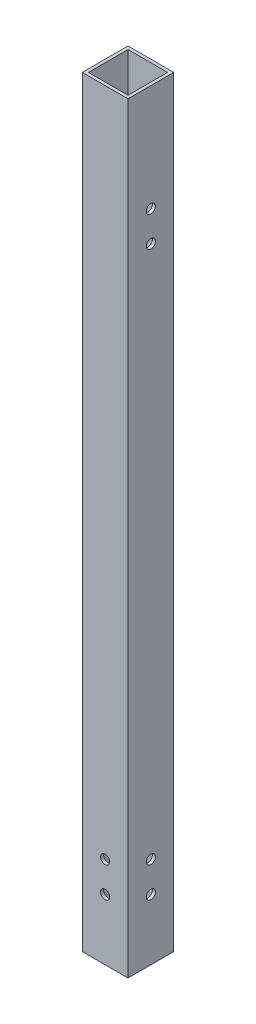
ISO-10303-21;
HEADER;
FILE_DESCRIPTION(('STEP AP214'),'2;1');
FILE_NAME('part.step','',(''),(''),'','','');
FILE_SCHEMA(('AUTOMOTIVE_DESIGN { 1 0 10303 214 1 1 1 1 }'));
ENDSEC;
DATA;
#1=APPLICATION_CONTEXT('core data for automotive mechanical design processes');
#2=APPLICATION_PROTOCOL_DEFINITION('international standard','automotive_design',2000,#1);
#3=PRODUCT_CONTEXT('',#1,'mechanical');
#4=PRODUCT('Part','Part','',(#3));
#5=PRODUCT_RELATED_PRODUCT_CATEGORY('part','',(#4));
#6=PRODUCT_DEFINITION_FORMATION('','',#4);
#7=PRODUCT_DEFINITION_CONTEXT('part definition',#1,'design');
#8=PRODUCT_DEFINITION('design','',#6,#7);
#9=PRODUCT_DEFINITION_SHAPE('','',#8);
#10=(LENGTH_UNIT() NAMED_UNIT(*) SI_UNIT(.MILLI.,.METRE.));
#11=(NAMED_UNIT(*) PLANE_ANGLE_UNIT() SI_UNIT($,.RADIAN.));
#12=(NAMED_UNIT(*) SI_UNIT($,.STERADIAN.) SOLID_ANGLE_UNIT());
#13=UNCERTAINTY_MEASURE_WITH_UNIT(LENGTH_MEASURE(1.E-05),#10,'distance_accuracy_value','');
#14=(GEOMETRIC_REPRESENTATION_CONTEXT(3) GLOBAL_UNCERTAINTY_ASSIGNED_CONTEXT((#13)) GLOBAL_UNIT_ASSIGNED_CONTEXT((#10,
#11,#12)) REPRESENTATION_CONTEXT('',''));
#15=CARTESIAN_POINT('',(0.,0.,0.));
#16=DIRECTION('',(0.,0.,1.));
#17=DIRECTION('',(1.,0.,0.));
#18=AXIS2_PLACEMENT_3D('',#15,#16,#17);
#19=CARTESIAN_POINT('',(15.,500.,15.));
#20=DIRECTION('',(0.,0.,-1.));
#21=DIRECTION('',(-1.,0.,0.));
#22=AXIS2_PLACEMENT_3D('',#19,#20,#21);
#23=PLANE('',#22);
#24=CARTESIAN_POINT('',(0.,60.,15.));
#25=DIRECTION('',(0.,0.,1.));
#26=DIRECTION('',(1.,0.,0.));
#27=AXIS2_PLACEMENT_3D('',#24,#25,#26);
#28=CIRCLE('',#27,3.);
#29=CARTESIAN_POINT('',(3.,60.,15.));
#30=VERTEX_POINT('',#29);
#31=EDGE_CURVE('E188',#30,#30,#28,.T.);
#32=ORIENTED_EDGE('',*,*,#31,.F.);
#33=EDGE_LOOP('',(#32));
#34=FACE_BOUND('',#33,.T.);
#35=CARTESIAN_POINT('',(0.,40.,15.));
#36=DIRECTION('',(0.,0.,1.));
#37=DIRECTION('',(1.,0.,0.));
#38=AXIS2_PLACEMENT_3D('',#35,#36,#37);
#39=CIRCLE('',#38,3.);
#40=CARTESIAN_POINT('',(3.,40.,15.));
#41=VERTEX_POINT('',#40);
#42=EDGE_CURVE('E207',#41,#41,#39,.T.);
#43=ORIENTED_EDGE('',*,*,#42,.F.);
#44=EDGE_LOOP('',(#43));
#45=FACE_BOUND('',#44,.T.);
#46=DIRECTION('',(1.,0.,0.));
#47=VECTOR('',#46,1.);
#48=CARTESIAN_POINT('',(15.,0.,15.));
#49=LINE('',#48,#47);
#50=CARTESIAN_POINT('',(-15.,0.,15.));
#51=VERTEX_POINT('',#50);
#52=CARTESIAN_POINT('',(15.,0.,15.));
#53=VERTEX_POINT('',#52);
#54=EDGE_CURVE('E134',#51,#53,#49,.T.);
#55=ORIENTED_EDGE('',*,*,#54,.T.);
#56=DIRECTION('',(0.,-1.,0.));
#57=VECTOR('',#56,1.);
#58=CARTESIAN_POINT('',(15.,500.,15.));
#59=LINE('',#58,#57);
#60=CARTESIAN_POINT('',(15.,500.,15.));
#61=VERTEX_POINT('',#60);
#62=EDGE_CURVE('E40',#61,#53,#59,.T.);
#63=ORIENTED_EDGE('',*,*,#62,.F.);
#64=DIRECTION('',(1.,0.,0.));
#65=VECTOR('',#64,1.);
#66=CARTESIAN_POINT('',(15.,500.,15.));
#67=LINE('',#66,#65);
#68=CARTESIAN_POINT('',(-15.,500.,15.));
#69=VERTEX_POINT('',#68);
#70=EDGE_CURVE('E141',#69,#61,#67,.T.);
#71=ORIENTED_EDGE('',*,*,#70,.F.);
#72=DIRECTION('',(0.,-1.,0.));
#73=VECTOR('',#72,1.);
#74=CARTESIAN_POINT('',(-15.,500.,15.));
#75=LINE('',#74,#73);
#76=EDGE_CURVE('E11',#69,#51,#75,.T.);
#77=ORIENTED_EDGE('',*,*,#76,.T.);
#78=EDGE_LOOP('',(#55,#63,#71,#77));
#79=FACE_BOUND('',#78,.T.);
#80=ADVANCED_FACE('F32',(#34,#45,#79),#23,.F.);
#81=CARTESIAN_POINT('',(15.,500.,-15.));
#82=DIRECTION('',(-1.,0.,0.));
#83=DIRECTION('',(0.,0.,1.));
#84=AXIS2_PLACEMENT_3D('',#81,#82,#83);
#85=PLANE('',#84);
#86=CARTESIAN_POINT('',(15.,410.,0.));
#87=DIRECTION('',(-1.,0.,0.));
#88=DIRECTION('',(0.,0.,1.));
#89=AXIS2_PLACEMENT_3D('',#86,#87,#88);
#90=CIRCLE('',#89,3.);
#91=CARTESIAN_POINT('',(15.,410.,3.));
#92=VERTEX_POINT('',#91);
#93=EDGE_CURVE('E484',#92,#92,#90,.T.);
#94=ORIENTED_EDGE('',*,*,#93,.T.);
#95=EDGE_LOOP('',(#94));
#96=FACE_BOUND('',#95,.T.);
#97=CARTESIAN_POINT('',(15.,430.,0.));
#98=DIRECTION('',(-1.,0.,0.));
#99=DIRECTION('',(0.,0.,1.));
#100=AXIS2_PLACEMENT_3D('',#97,#98,#99);
#101=CIRCLE('',#100,3.);
#102=CARTESIAN_POINT('',(15.,430.,3.));
#103=VERTEX_POINT('',#102);
#104=EDGE_CURVE('E184',#103,#103,#101,.T.);
#105=ORIENTED_EDGE('',*,*,#104,.T.);
#106=EDGE_LOOP('',(#105));
#107=FACE_BOUND('',#106,.T.);
#108=CARTESIAN_POINT('',(15.,40.,0.));
#109=DIRECTION('',(1.,0.,0.));
#110=DIRECTION('',(0.,0.,-1.));
#111=AXIS2_PLACEMENT_3D('',#108,#109,#110);
#112=CIRCLE('',#111,3.);
#113=CARTESIAN_POINT('',(15.,40.,-3.));
#114=VERTEX_POINT('',#113);
#115=EDGE_CURVE('E214',#114,#114,#112,.T.);
#116=ORIENTED_EDGE('',*,*,#115,.F.);
#117=EDGE_LOOP('',(#116));
#118=FACE_BOUND('',#117,.T.);
#119=CARTESIAN_POINT('',(15.,60.,0.));
#120=DIRECTION('',(1.,0.,0.));
#121=DIRECTION('',(0.,0.,-1.));
#122=AXIS2_PLACEMENT_3D('',#119,#120,#121);
#123=CIRCLE('',#122,3.);
#124=CARTESIAN_POINT('',(15.,60.,-3.));
#125=VERTEX_POINT('',#124);
#126=EDGE_CURVE('E221',#125,#125,#123,.T.);
#127=ORIENTED_EDGE('',*,*,#126,.F.);
#128=EDGE_LOOP('',(#127));
#129=FACE_BOUND('',#128,.T.);
#130=DIRECTION('',(0.,0.,-1.));
#131=VECTOR('',#130,1.);
#132=CARTESIAN_POINT('',(15.,0.,-15.));
#133=LINE('',#132,#131);
#134=CARTESIAN_POINT('',(15.,0.,-15.));
#135=VERTEX_POINT('',#134);
#136=EDGE_CURVE('E151',#53,#135,#133,.T.);
#137=ORIENTED_EDGE('',*,*,#136,.T.);
#138=DIRECTION('',(0.,-1.,0.));
#139=VECTOR('',#138,1.);
#140=CARTESIAN_POINT('',(15.,500.,-15.));
#141=LINE('',#140,#139);
#142=CARTESIAN_POINT('',(15.,500.,-15.));
#143=VERTEX_POINT('',#142);
#144=EDGE_CURVE('E158',#143,#135,#141,.T.);
#145=ORIENTED_EDGE('',*,*,#144,.F.);
#146=DIRECTION('',(0.,0.,-1.));
#147=VECTOR('',#146,1.);
#148=CARTESIAN_POINT('',(15.,500.,-15.));
#149=LINE('',#148,#147);
#150=EDGE_CURVE('E144',#61,#143,#149,.T.);
#151=ORIENTED_EDGE('',*,*,#150,.F.);
#152=ORIENTED_EDGE('',*,*,#62,.T.);
#153=EDGE_LOOP('',(#137,#145,#151,#152));
#154=FACE_BOUND('',#153,.T.);
#155=ADVANCED_FACE('F229',(#96,#107,#118,#129,#154),#85,.F.);
#156=CARTESIAN_POINT('',(-15.,500.,-15.));
#157=DIRECTION('',(0.,0.,1.));
#158=DIRECTION('',(1.,0.,0.));
#159=AXIS2_PLACEMENT_3D('',#156,#157,#158);
#160=PLANE('',#159);
#161=CARTESIAN_POINT('',(0.,60.,-15.));
#162=DIRECTION('',(0.,0.,1.));
#163=DIRECTION('',(1.,0.,0.));
#164=AXIS2_PLACEMENT_3D('',#161,#162,#163);
#165=CIRCLE('',#164,3.);
#166=CARTESIAN_POINT('',(3.,60.,-15.));
#167=VERTEX_POINT('',#166);
#168=EDGE_CURVE('E180',#167,#167,#165,.T.);
#169=ORIENTED_EDGE('',*,*,#168,.T.);
#170=EDGE_LOOP('',(#169));
#171=FACE_BOUND('',#170,.T.);
#172=CARTESIAN_POINT('',(0.,40.,-15.));
#173=DIRECTION('',(0.,0.,1.));
#174=DIRECTION('',(1.,0.,0.));
#175=AXIS2_PLACEMENT_3D('',#172,#173,#174);
#176=CIRCLE('',#175,3.);
#177=CARTESIAN_POINT('',(3.,40.,-15.));
#178=VERTEX_POINT('',#177);
#179=EDGE_CURVE('E176',#178,#178,#176,.T.);
#180=ORIENTED_EDGE('',*,*,#179,.T.);
#181=EDGE_LOOP('',(#180));
#182=FACE_BOUND('',#181,.T.);
#183=DIRECTION('',(-1.,0.,0.));
#184=VECTOR('',#183,1.);
#185=CARTESIAN_POINT('',(-15.,0.,-15.));
#186=LINE('',#185,#184);
#187=CARTESIAN_POINT('',(-15.,0.,-15.));
#188=VERTEX_POINT('',#187);
#189=EDGE_CURVE('E153',#135,#188,#186,.T.);
#190=ORIENTED_EDGE('',*,*,#189,.T.);
#191=DIRECTION('',(0.,-1.,0.));
#192=VECTOR('',#191,1.);
#193=CARTESIAN_POINT('',(-15.,500.,-15.));
#194=LINE('',#193,#192);
#195=CARTESIAN_POINT('',(-15.,500.,-15.));
#196=VERTEX_POINT('',#195);
#197=EDGE_CURVE('E149',#196,#188,#194,.T.);
#198=ORIENTED_EDGE('',*,*,#197,.F.);
#199=DIRECTION('',(-1.,0.,0.));
#200=VECTOR('',#199,1.);
#201=CARTESIAN_POINT('',(-15.,500.,-15.));
#202=LINE('',#201,#200);
#203=EDGE_CURVE('E146',#143,#196,#202,.T.);
#204=ORIENTED_EDGE('',*,*,#203,.F.);
#205=ORIENTED_EDGE('',*,*,#144,.T.);
#206=EDGE_LOOP('',(#190,#198,#204,#205));
#207=FACE_BOUND('',#206,.T.);
#208=ADVANCED_FACE('F232',(#171,#182,#207),#160,.F.);
#209=CARTESIAN_POINT('',(-15.,500.,0.));
#210=DIRECTION('',(1.,0.,0.));
#211=DIRECTION('',(0.,0.,-1.));
#212=AXIS2_PLACEMENT_3D('',#209,#210,#211);
#213=PLANE('',#212);
#214=CARTESIAN_POINT('',(-15.,410.,0.));
#215=DIRECTION('',(-1.,0.,0.));
#216=DIRECTION('',(0.,0.,1.));
#217=AXIS2_PLACEMENT_3D('',#214,#215,#216);
#218=CIRCLE('',#217,3.);
#219=CARTESIAN_POINT('',(-15.,410.,3.));
#220=VERTEX_POINT('',#219);
#221=EDGE_CURVE('E488',#220,#220,#218,.T.);
#222=ORIENTED_EDGE('',*,*,#221,.F.);
#223=EDGE_LOOP('',(#222));
#224=FACE_BOUND('',#223,.T.);
#225=CARTESIAN_POINT('',(-15.,430.,0.));
#226=DIRECTION('',(-1.,0.,0.));
#227=DIRECTION('',(0.,0.,1.));
#228=AXIS2_PLACEMENT_3D('',#225,#226,#227);
#229=CIRCLE('',#228,3.);
#230=CARTESIAN_POINT('',(-15.,430.,3.));
#231=VERTEX_POINT('',#230);
#232=EDGE_CURVE('E191',#231,#231,#229,.T.);
#233=ORIENTED_EDGE('',*,*,#232,.F.);
#234=EDGE_LOOP('',(#233));
#235=FACE_BOUND('',#234,.T.);
#236=CARTESIAN_POINT('',(-15.,40.,0.));
#237=DIRECTION('',(1.,0.,0.));
#238=DIRECTION('',(0.,0.,-1.));
#239=AXIS2_PLACEMENT_3D('',#236,#237,#238);
#240=CIRCLE('',#239,3.);
#241=CARTESIAN_POINT('',(-15.,40.,-3.));
#242=VERTEX_POINT('',#241);
#243=EDGE_CURVE('E171',#242,#242,#240,.T.);
#244=ORIENTED_EDGE('',*,*,#243,.T.);
#245=EDGE_LOOP('',(#244));
#246=FACE_BOUND('',#245,.T.);
#247=CARTESIAN_POINT('',(-15.,60.,0.));
#248=DIRECTION('',(1.,0.,0.));
#249=DIRECTION('',(0.,0.,-1.));
#250=AXIS2_PLACEMENT_3D('',#247,#248,#249);
#251=CIRCLE('',#250,3.);
#252=CARTESIAN_POINT('',(-15.,60.,-3.));
#253=VERTEX_POINT('',#252);
#254=EDGE_CURVE('E166',#253,#253,#251,.T.);
#255=ORIENTED_EDGE('',*,*,#254,.T.);
#256=EDGE_LOOP('',(#255));
#257=FACE_BOUND('',#256,.T.);
#258=DIRECTION('',(0.,0.,1.));
#259=VECTOR('',#258,1.);
#260=CARTESIAN_POINT('',(-15.,0.,0.));
#261=LINE('',#260,#259);
#262=EDGE_CURVE('E142',#188,#51,#261,.T.);
#263=ORIENTED_EDGE('',*,*,#262,.T.);
#264=ORIENTED_EDGE('',*,*,#76,.F.);
#265=DIRECTION('',(0.,0.,1.));
#266=VECTOR('',#265,1.);
#267=CARTESIAN_POINT('',(-15.,500.,15.));
#268=LINE('',#267,#266);
#269=EDGE_CURVE('E138',#196,#69,#268,.T.);
#270=ORIENTED_EDGE('',*,*,#269,.F.);
#271=ORIENTED_EDGE('',*,*,#197,.T.);
#272=EDGE_LOOP('',(#263,#264,#270,#271));
#273=FACE_BOUND('',#272,.T.);
#274=ADVANCED_FACE('F246',(#224,#235,#246,#257,#273),#213,.F.);
#275=CARTESIAN_POINT('',(0.,500.,0.));
#276=DIRECTION('',(0.,-1.,0.));
#277=DIRECTION('',(0.,0.,-1.));
#278=AXIS2_PLACEMENT_3D('',#275,#276,#277);
#279=PLANE('',#278);
#280=DIRECTION('',(0.,0.,1.));
#281=VECTOR('',#280,1.);
#282=CARTESIAN_POINT('',(-13.,500.,-13.));
#283=LINE('',#282,#281);
#284=CARTESIAN_POINT('',(-13.,500.,-13.));
#285=VERTEX_POINT('',#284);
#286=CARTESIAN_POINT('',(-13.,500.,13.));
#287=VERTEX_POINT('',#286);
#288=EDGE_CURVE('E128',#285,#287,#283,.T.);
#289=ORIENTED_EDGE('',*,*,#288,.F.);
#290=DIRECTION('',(-1.,0.,0.));
#291=VECTOR('',#290,1.);
#292=CARTESIAN_POINT('',(13.,500.,-13.));
#293=LINE('',#292,#291);
#294=CARTESIAN_POINT('',(13.,500.,-13.));
#295=VERTEX_POINT('',#294);
#296=EDGE_CURVE('E48',#295,#285,#293,.T.);
#297=ORIENTED_EDGE('',*,*,#296,.F.);
#298=DIRECTION('',(0.,0.,-1.));
#299=VECTOR('',#298,1.);
#300=CARTESIAN_POINT('',(13.,500.,13.));
#301=LINE('',#300,#299);
#302=CARTESIAN_POINT('',(13.,500.,13.));
#303=VERTEX_POINT('',#302);
#304=EDGE_CURVE('E116',#303,#295,#301,.T.);
#305=ORIENTED_EDGE('',*,*,#304,.F.);
#306=DIRECTION('',(1.,0.,0.));
#307=VECTOR('',#306,1.);
#308=CARTESIAN_POINT('',(-13.,500.,13.));
#309=LINE('',#308,#307);
#310=EDGE_CURVE('E119',#287,#303,#309,.T.);
#311=ORIENTED_EDGE('',*,*,#310,.F.);
#312=EDGE_LOOP('',(#289,#297,#305,#311));
#313=FACE_BOUND('',#312,.T.);
#314=ORIENTED_EDGE('',*,*,#269,.T.);
#315=ORIENTED_EDGE('',*,*,#70,.T.);
#316=ORIENTED_EDGE('',*,*,#150,.T.);
#317=ORIENTED_EDGE('',*,*,#203,.T.);
#318=EDGE_LOOP('',(#314,#315,#316,#317));
#319=FACE_BOUND('',#318,.T.);
#320=ADVANCED_FACE('F248',(#313,#319),#279,.F.);
#321=CARTESIAN_POINT('',(0.,0.,0.));
#322=DIRECTION('',(0.,-1.,0.));
#323=DIRECTION('',(0.,0.,-1.));
#324=AXIS2_PLACEMENT_3D('',#321,#322,#323);
#325=PLANE('',#324);
#326=DIRECTION('',(-1.,0.,0.));
#327=VECTOR('',#326,1.);
#328=CARTESIAN_POINT('',(13.,0.,-13.));
#329=LINE('',#328,#327);
#330=CARTESIAN_POINT('',(13.,0.,-13.));
#331=VERTEX_POINT('',#330);
#332=CARTESIAN_POINT('',(-13.,0.,-13.));
#333=VERTEX_POINT('',#332);
#334=EDGE_CURVE('E100',#331,#333,#329,.T.);
#335=ORIENTED_EDGE('',*,*,#334,.T.);
#336=DIRECTION('',(0.,0.,1.));
#337=VECTOR('',#336,1.);
#338=CARTESIAN_POINT('',(-13.,0.,-13.));
#339=LINE('',#338,#337);
#340=CARTESIAN_POINT('',(-13.,0.,13.));
#341=VERTEX_POINT('',#340);
#342=EDGE_CURVE('E109',#333,#341,#339,.T.);
#343=ORIENTED_EDGE('',*,*,#342,.T.);
#344=DIRECTION('',(1.,0.,0.));
#345=VECTOR('',#344,1.);
#346=CARTESIAN_POINT('',(-13.,0.,13.));
#347=LINE('',#346,#345);
#348=CARTESIAN_POINT('',(13.,0.,13.));
#349=VERTEX_POINT('',#348);
#350=EDGE_CURVE('E56',#341,#349,#347,.T.);
#351=ORIENTED_EDGE('',*,*,#350,.T.);
#352=DIRECTION('',(0.,0.,-1.));
#353=VECTOR('',#352,1.);
#354=CARTESIAN_POINT('',(13.,0.,13.));
#355=LINE('',#354,#353);
#356=EDGE_CURVE('E106',#349,#331,#355,.T.);
#357=ORIENTED_EDGE('',*,*,#356,.T.);
#358=EDGE_LOOP('',(#335,#343,#351,#357));
#359=FACE_BOUND('',#358,.T.);
#360=ORIENTED_EDGE('',*,*,#54,.F.);
#361=ORIENTED_EDGE('',*,*,#262,.F.);
#362=ORIENTED_EDGE('',*,*,#189,.F.);
#363=ORIENTED_EDGE('',*,*,#136,.F.);
#364=EDGE_LOOP('',(#360,#361,#362,#363));
#365=FACE_BOUND('',#364,.T.);
#366=ADVANCED_FACE('F113',(#359,#365),#325,.T.);
#367=CARTESIAN_POINT('',(13.,0.,-13.));
#368=DIRECTION('',(0.,0.,-1.));
#369=DIRECTION('',(-1.,0.,0.));
#370=AXIS2_PLACEMENT_3D('',#367,#368,#369);
#371=PLANE('',#370);
#372=CARTESIAN_POINT('',(0.,60.,-13.));
#373=DIRECTION('',(0.,0.,-1.));
#374=DIRECTION('',(-1.,0.,0.));
#375=AXIS2_PLACEMENT_3D('',#372,#373,#374);
#376=CIRCLE('',#375,3.);
#377=CARTESIAN_POINT('',(-3.,60.,-13.));
#378=VERTEX_POINT('',#377);
#379=EDGE_CURVE('E179',#378,#378,#376,.T.);
#380=ORIENTED_EDGE('',*,*,#379,.T.);
#381=EDGE_LOOP('',(#380));
#382=FACE_BOUND('',#381,.T.);
#383=CARTESIAN_POINT('',(0.,40.,-13.));
#384=DIRECTION('',(0.,0.,-1.));
#385=DIRECTION('',(-1.,0.,0.));
#386=AXIS2_PLACEMENT_3D('',#383,#384,#385);
#387=CIRCLE('',#386,3.);
#388=CARTESIAN_POINT('',(-3.,40.,-13.));
#389=VERTEX_POINT('',#388);
#390=EDGE_CURVE('E175',#389,#389,#387,.T.);
#391=ORIENTED_EDGE('',*,*,#390,.T.);
#392=EDGE_LOOP('',(#391));
#393=FACE_BOUND('',#392,.T.);
#394=ORIENTED_EDGE('',*,*,#296,.T.);
#395=DIRECTION('',(0.,1.,0.));
#396=VECTOR('',#395,1.);
#397=CARTESIAN_POINT('',(-13.,0.,-13.));
#398=LINE('',#397,#396);
#399=EDGE_CURVE('E96',#333,#285,#398,.T.);
#400=ORIENTED_EDGE('',*,*,#399,.F.);
#401=ORIENTED_EDGE('',*,*,#334,.F.);
#402=DIRECTION('',(0.,1.,0.));
#403=VECTOR('',#402,1.);
#404=CARTESIAN_POINT('',(13.,0.,-13.));
#405=LINE('',#404,#403);
#406=EDGE_CURVE('E132',#331,#295,#405,.T.);
#407=ORIENTED_EDGE('',*,*,#406,.T.);
#408=EDGE_LOOP('',(#394,#400,#401,#407));
#409=FACE_BOUND('',#408,.T.);
#410=ADVANCED_FACE('F98',(#382,#393,#409),#371,.F.);
#411=CARTESIAN_POINT('',(13.,0.,13.));
#412=DIRECTION('',(1.,0.,0.));
#413=DIRECTION('',(0.,0.,-1.));
#414=AXIS2_PLACEMENT_3D('',#411,#412,#413);
#415=PLANE('',#414);
#416=CARTESIAN_POINT('',(13.,410.,0.));
#417=DIRECTION('',(1.,0.,0.));
#418=DIRECTION('',(0.,0.,-1.));
#419=AXIS2_PLACEMENT_3D('',#416,#417,#418);
#420=CIRCLE('',#419,3.);
#421=CARTESIAN_POINT('',(13.,410.,-3.));
#422=VERTEX_POINT('',#421);
#423=EDGE_CURVE('E196',#422,#422,#420,.T.);
#424=ORIENTED_EDGE('',*,*,#423,.T.);
#425=EDGE_LOOP('',(#424));
#426=FACE_BOUND('',#425,.T.);
#427=CARTESIAN_POINT('',(13.,430.,0.));
#428=DIRECTION('',(1.,0.,0.));
#429=DIRECTION('',(0.,0.,-1.));
#430=AXIS2_PLACEMENT_3D('',#427,#428,#429);
#431=CIRCLE('',#430,3.);
#432=CARTESIAN_POINT('',(13.,430.,-3.));
#433=VERTEX_POINT('',#432);
#434=EDGE_CURVE('E183',#433,#433,#431,.T.);
#435=ORIENTED_EDGE('',*,*,#434,.T.);
#436=EDGE_LOOP('',(#435));
#437=FACE_BOUND('',#436,.T.);
#438=CARTESIAN_POINT('',(13.,40.,0.));
#439=DIRECTION('',(1.,0.,0.));
#440=DIRECTION('',(0.,0.,-1.));
#441=AXIS2_PLACEMENT_3D('',#438,#439,#440);
#442=CIRCLE('',#441,3.);
#443=CARTESIAN_POINT('',(13.,40.,-3.));
#444=VERTEX_POINT('',#443);
#445=EDGE_CURVE('E170',#444,#444,#442,.T.);
#446=ORIENTED_EDGE('',*,*,#445,.T.);
#447=EDGE_LOOP('',(#446));
#448=FACE_BOUND('',#447,.T.);
#449=CARTESIAN_POINT('',(13.,60.,0.));
#450=DIRECTION('',(1.,0.,0.));
#451=DIRECTION('',(0.,0.,-1.));
#452=AXIS2_PLACEMENT_3D('',#449,#450,#451);
#453=CIRCLE('',#452,3.);
#454=CARTESIAN_POINT('',(13.,60.,-3.));
#455=VERTEX_POINT('',#454);
#456=EDGE_CURVE('E122',#455,#455,#453,.T.);
#457=ORIENTED_EDGE('',*,*,#456,.T.);
#458=EDGE_LOOP('',(#457));
#459=FACE_BOUND('',#458,.T.);
#460=ORIENTED_EDGE('',*,*,#304,.T.);
#461=ORIENTED_EDGE('',*,*,#406,.F.);
#462=ORIENTED_EDGE('',*,*,#356,.F.);
#463=DIRECTION('',(0.,1.,0.));
#464=VECTOR('',#463,1.);
#465=CARTESIAN_POINT('',(13.,0.,13.));
#466=LINE('',#465,#464);
#467=EDGE_CURVE('E135',#349,#303,#466,.T.);
#468=ORIENTED_EDGE('',*,*,#467,.T.);
#469=EDGE_LOOP('',(#460,#461,#462,#468));
#470=FACE_BOUND('',#469,.T.);
#471=ADVANCED_FACE('F268',(#426,#437,#448,#459,#470),#415,.F.);
#472=CARTESIAN_POINT('',(-13.,0.,13.));
#473=DIRECTION('',(0.,0.,1.));
#474=DIRECTION('',(1.,0.,0.));
#475=AXIS2_PLACEMENT_3D('',#472,#473,#474);
#476=PLANE('',#475);
#477=CARTESIAN_POINT('',(0.,60.,13.));
#478=DIRECTION('',(0.,0.,1.));
#479=DIRECTION('',(1.,0.,0.));
#480=AXIS2_PLACEMENT_3D('',#477,#478,#479);
#481=CIRCLE('',#480,3.);
#482=CARTESIAN_POINT('',(3.,60.,13.));
#483=VERTEX_POINT('',#482);
#484=EDGE_CURVE('E177',#483,#483,#481,.T.);
#485=ORIENTED_EDGE('',*,*,#484,.T.);
#486=EDGE_LOOP('',(#485));
#487=FACE_BOUND('',#486,.T.);
#488=CARTESIAN_POINT('',(0.,40.,13.));
#489=DIRECTION('',(0.,0.,1.));
#490=DIRECTION('',(1.,0.,0.));
#491=AXIS2_PLACEMENT_3D('',#488,#489,#490);
#492=CIRCLE('',#491,3.);
#493=CARTESIAN_POINT('',(3.,40.,13.));
#494=VERTEX_POINT('',#493);
#495=EDGE_CURVE('E172',#494,#494,#492,.T.);
#496=ORIENTED_EDGE('',*,*,#495,.T.);
#497=EDGE_LOOP('',(#496));
#498=FACE_BOUND('',#497,.T.);
#499=ORIENTED_EDGE('',*,*,#310,.T.);
#500=ORIENTED_EDGE('',*,*,#467,.F.);
#501=ORIENTED_EDGE('',*,*,#350,.F.);
#502=DIRECTION('',(0.,1.,0.));
#503=VECTOR('',#502,1.);
#504=CARTESIAN_POINT('',(-13.,0.,13.));
#505=LINE('',#504,#503);
#506=EDGE_CURVE('E105',#341,#287,#505,.T.);
#507=ORIENTED_EDGE('',*,*,#506,.T.);
#508=EDGE_LOOP('',(#499,#500,#501,#507));
#509=FACE_BOUND('',#508,.T.);
#510=ADVANCED_FACE('F266',(#487,#498,#509),#476,.F.);
#511=CARTESIAN_POINT('',(-13.,0.,-13.));
#512=DIRECTION('',(-1.,0.,0.));
#513=DIRECTION('',(0.,0.,1.));
#514=AXIS2_PLACEMENT_3D('',#511,#512,#513);
#515=PLANE('',#514);
#516=CARTESIAN_POINT('',(-13.,410.,0.));
#517=DIRECTION('',(-1.,0.,0.));
#518=DIRECTION('',(0.,0.,1.));
#519=AXIS2_PLACEMENT_3D('',#516,#517,#518);
#520=CIRCLE('',#519,3.);
#521=CARTESIAN_POINT('',(-13.,410.,3.));
#522=VERTEX_POINT('',#521);
#523=EDGE_CURVE('E35',#522,#522,#520,.T.);
#524=ORIENTED_EDGE('',*,*,#523,.T.);
#525=EDGE_LOOP('',(#524));
#526=FACE_BOUND('',#525,.T.);
#527=CARTESIAN_POINT('',(-13.,430.,0.));
#528=DIRECTION('',(-1.,0.,0.));
#529=DIRECTION('',(0.,0.,1.));
#530=AXIS2_PLACEMENT_3D('',#527,#528,#529);
#531=CIRCLE('',#530,3.);
#532=CARTESIAN_POINT('',(-13.,430.,3.));
#533=VERTEX_POINT('',#532);
#534=EDGE_CURVE('E181',#533,#533,#531,.T.);
#535=ORIENTED_EDGE('',*,*,#534,.T.);
#536=EDGE_LOOP('',(#535));
#537=FACE_BOUND('',#536,.T.);
#538=CARTESIAN_POINT('',(-13.,40.,0.));
#539=DIRECTION('',(-1.,0.,0.));
#540=DIRECTION('',(0.,0.,1.));
#541=AXIS2_PLACEMENT_3D('',#538,#539,#540);
#542=CIRCLE('',#541,3.);
#543=CARTESIAN_POINT('',(-13.,40.,3.));
#544=VERTEX_POINT('',#543);
#545=EDGE_CURVE('E167',#544,#544,#542,.T.);
#546=ORIENTED_EDGE('',*,*,#545,.T.);
#547=EDGE_LOOP('',(#546));
#548=FACE_BOUND('',#547,.T.);
#549=CARTESIAN_POINT('',(-13.,60.,0.));
#550=DIRECTION('',(-1.,0.,0.));
#551=DIRECTION('',(0.,0.,1.));
#552=AXIS2_PLACEMENT_3D('',#549,#550,#551);
#553=CIRCLE('',#552,3.);
#554=CARTESIAN_POINT('',(-13.,60.,3.));
#555=VERTEX_POINT('',#554);
#556=EDGE_CURVE('E163',#555,#555,#553,.T.);
#557=ORIENTED_EDGE('',*,*,#556,.T.);
#558=EDGE_LOOP('',(#557));
#559=FACE_BOUND('',#558,.T.);
#560=ORIENTED_EDGE('',*,*,#288,.T.);
#561=ORIENTED_EDGE('',*,*,#506,.F.);
#562=ORIENTED_EDGE('',*,*,#342,.F.);
#563=ORIENTED_EDGE('',*,*,#399,.T.);
#564=EDGE_LOOP('',(#560,#561,#562,#563));
#565=FACE_BOUND('',#564,.T.);
#566=ADVANCED_FACE('F110',(#526,#537,#548,#559,#565),#515,.F.);
#567=CARTESIAN_POINT('',(-15.,60.,0.));
#568=DIRECTION('',(1.,0.,0.));
#569=DIRECTION('',(0.,0.,-1.));
#570=AXIS2_PLACEMENT_3D('',#567,#568,#569);
#571=CYLINDRICAL_SURFACE('',#570,3.);
#572=ORIENTED_EDGE('',*,*,#254,.F.);
#573=EDGE_LOOP('',(#572));
#574=FACE_BOUND('',#573,.T.);
#575=ORIENTED_EDGE('',*,*,#556,.F.);
#576=EDGE_LOOP('',(#575));
#577=FACE_BOUND('',#576,.T.);
#578=ADVANCED_FACE('F289',(#574,#577),#571,.F.);
#579=ORIENTED_EDGE('',*,*,#126,.T.);
#580=EDGE_LOOP('',(#579));
#581=FACE_BOUND('',#580,.T.);
#582=ORIENTED_EDGE('',*,*,#456,.F.);
#583=EDGE_LOOP('',(#582));
#584=FACE_BOUND('',#583,.T.);
#585=ADVANCED_FACE('F226',(#581,#584),#571,.F.);
#586=CARTESIAN_POINT('',(-15.,40.,0.));
#587=DIRECTION('',(1.,0.,0.));
#588=DIRECTION('',(0.,0.,-1.));
#589=AXIS2_PLACEMENT_3D('',#586,#587,#588);
#590=CYLINDRICAL_SURFACE('',#589,3.);
#591=ORIENTED_EDGE('',*,*,#243,.F.);
#592=EDGE_LOOP('',(#591));
#593=FACE_BOUND('',#592,.T.);
#594=ORIENTED_EDGE('',*,*,#545,.F.);
#595=EDGE_LOOP('',(#594));
#596=FACE_BOUND('',#595,.T.);
#597=ADVANCED_FACE('F320',(#593,#596),#590,.F.);
#598=ORIENTED_EDGE('',*,*,#115,.T.);
#599=EDGE_LOOP('',(#598));
#600=FACE_BOUND('',#599,.T.);
#601=ORIENTED_EDGE('',*,*,#445,.F.);
#602=EDGE_LOOP('',(#601));
#603=FACE_BOUND('',#602,.T.);
#604=ADVANCED_FACE('F262',(#600,#603),#590,.F.);
#605=CARTESIAN_POINT('',(0.,40.,-15.));
#606=DIRECTION('',(0.,0.,1.));
#607=DIRECTION('',(1.,0.,0.));
#608=AXIS2_PLACEMENT_3D('',#605,#606,#607);
#609=CYLINDRICAL_SURFACE('',#608,3.);
#610=ORIENTED_EDGE('',*,*,#42,.T.);
#611=EDGE_LOOP('',(#610));
#612=FACE_BOUND('',#611,.T.);
#613=ORIENTED_EDGE('',*,*,#495,.F.);
#614=EDGE_LOOP('',(#613));
#615=FACE_BOUND('',#614,.T.);
#616=ADVANCED_FACE('F258',(#612,#615),#609,.F.);
#617=ORIENTED_EDGE('',*,*,#179,.F.);
#618=EDGE_LOOP('',(#617));
#619=FACE_BOUND('',#618,.T.);
#620=ORIENTED_EDGE('',*,*,#390,.F.);
#621=EDGE_LOOP('',(#620));
#622=FACE_BOUND('',#621,.T.);
#623=ADVANCED_FACE('F261',(#619,#622),#609,.F.);
#624=CARTESIAN_POINT('',(0.,60.,-15.));
#625=DIRECTION('',(0.,0.,1.));
#626=DIRECTION('',(1.,0.,0.));
#627=AXIS2_PLACEMENT_3D('',#624,#625,#626);
#628=CYLINDRICAL_SURFACE('',#627,3.);
#629=ORIENTED_EDGE('',*,*,#31,.T.);
#630=EDGE_LOOP('',(#629));
#631=FACE_BOUND('',#630,.T.);
#632=ORIENTED_EDGE('',*,*,#484,.F.);
#633=EDGE_LOOP('',(#632));
#634=FACE_BOUND('',#633,.T.);
#635=ADVANCED_FACE('F309',(#631,#634),#628,.F.);
#636=ORIENTED_EDGE('',*,*,#168,.F.);
#637=EDGE_LOOP('',(#636));
#638=FACE_BOUND('',#637,.T.);
#639=ORIENTED_EDGE('',*,*,#379,.F.);
#640=EDGE_LOOP('',(#639));
#641=FACE_BOUND('',#640,.T.);
#642=ADVANCED_FACE('F315',(#638,#641),#628,.F.);
#643=CARTESIAN_POINT('',(15.,430.,0.));
#644=DIRECTION('',(-1.,0.,0.));
#645=DIRECTION('',(0.,0.,1.));
#646=AXIS2_PLACEMENT_3D('',#643,#644,#645);
#647=CYLINDRICAL_SURFACE('',#646,3.);
#648=ORIENTED_EDGE('',*,*,#232,.T.);
#649=EDGE_LOOP('',(#648));
#650=FACE_BOUND('',#649,.T.);
#651=ORIENTED_EDGE('',*,*,#534,.F.);
#652=EDGE_LOOP('',(#651));
#653=FACE_BOUND('',#652,.T.);
#654=ADVANCED_FACE('F385',(#650,#653),#647,.F.);
#655=ORIENTED_EDGE('',*,*,#104,.F.);
#656=EDGE_LOOP('',(#655));
#657=FACE_BOUND('',#656,.T.);
#658=ORIENTED_EDGE('',*,*,#434,.F.);
#659=EDGE_LOOP('',(#658));
#660=FACE_BOUND('',#659,.T.);
#661=ADVANCED_FACE('F450',(#657,#660),#647,.F.);
#662=CARTESIAN_POINT('',(15.,410.,0.));
#663=DIRECTION('',(-1.,0.,0.));
#664=DIRECTION('',(0.,0.,1.));
#665=AXIS2_PLACEMENT_3D('',#662,#663,#664);
#666=CYLINDRICAL_SURFACE('',#665,3.);
#667=ORIENTED_EDGE('',*,*,#221,.T.);
#668=EDGE_LOOP('',(#667));
#669=FACE_BOUND('',#668,.T.);
#670=ORIENTED_EDGE('',*,*,#523,.F.);
#671=EDGE_LOOP('',(#670));
#672=FACE_BOUND('',#671,.T.);
#673=ADVANCED_FACE('F456',(#669,#672),#666,.F.);
#674=ORIENTED_EDGE('',*,*,#93,.F.);
#675=EDGE_LOOP('',(#674));
#676=FACE_BOUND('',#675,.T.);
#677=ORIENTED_EDGE('',*,*,#423,.F.);
#678=EDGE_LOOP('',(#677));
#679=FACE_BOUND('',#678,.T.);
#680=ADVANCED_FACE('F463',(#676,#679),#666,.F.);
#681=CLOSED_SHELL('',(#80,#155,#208,#274,#320,#366,#410,#471,#510,#566,#578,#585,#597,#604,#616,
#623,#635,#642,#654,#661,#673,#680));
#682=MANIFOLD_SOLID_BREP('B2',#681);
#683=ADVANCED_BREP_SHAPE_REPRESENTATION('',(#18,#682),#14);
#684=SHAPE_DEFINITION_REPRESENTATION(#9,#683);
ENDSEC;
END-ISO-10303-21;
